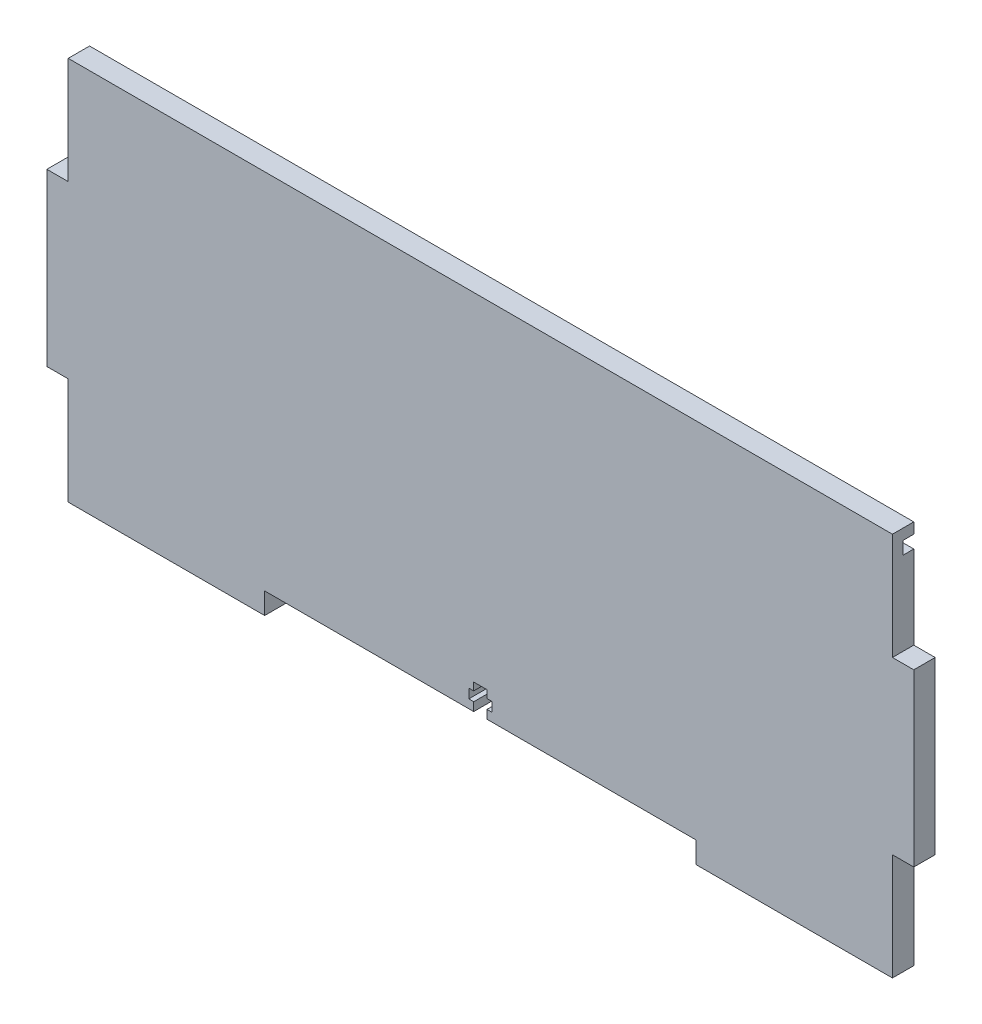
ISO-10303-21;
HEADER;
FILE_DESCRIPTION(('STEP AP214'),'2;1');
FILE_NAME('part.step','',(''),(''),'','','');
FILE_SCHEMA(('AUTOMOTIVE_DESIGN { 1 0 10303 214 1 1 1 1 }'));
ENDSEC;
DATA;
#1=APPLICATION_CONTEXT('core data for automotive mechanical design processes');
#2=APPLICATION_PROTOCOL_DEFINITION('international standard','automotive_design',2000,#1);
#3=PRODUCT_CONTEXT('',#1,'mechanical');
#4=PRODUCT('Part','Part','',(#3));
#5=PRODUCT_RELATED_PRODUCT_CATEGORY('part','',(#4));
#6=PRODUCT_DEFINITION_FORMATION('','',#4);
#7=PRODUCT_DEFINITION_CONTEXT('part definition',#1,'design');
#8=PRODUCT_DEFINITION('design','',#6,#7);
#9=PRODUCT_DEFINITION_SHAPE('','',#8);
#10=(LENGTH_UNIT() NAMED_UNIT(*) SI_UNIT(.MILLI.,.METRE.));
#11=(NAMED_UNIT(*) PLANE_ANGLE_UNIT() SI_UNIT($,.RADIAN.));
#12=(NAMED_UNIT(*) SI_UNIT($,.STERADIAN.) SOLID_ANGLE_UNIT());
#13=UNCERTAINTY_MEASURE_WITH_UNIT(LENGTH_MEASURE(1.E-05),#10,'distance_accuracy_value','');
#14=(GEOMETRIC_REPRESENTATION_CONTEXT(3) GLOBAL_UNCERTAINTY_ASSIGNED_CONTEXT((#13)) GLOBAL_UNIT_ASSIGNED_CONTEXT((#10,
#11,#12)) REPRESENTATION_CONTEXT('',''));
#15=CARTESIAN_POINT('',(0.,0.,0.));
#16=DIRECTION('',(0.,0.,1.));
#17=DIRECTION('',(1.,0.,0.));
#18=AXIS2_PLACEMENT_3D('',#15,#16,#17);
#19=CARTESIAN_POINT('',(0.,0.,5.));
#20=DIRECTION('',(0.,0.,-1.));
#21=DIRECTION('',(-1.,0.,0.));
#22=AXIS2_PLACEMENT_3D('',#19,#20,#21);
#23=PLANE('',#22);
#24=DIRECTION('',(0.,-1.,0.));
#25=VECTOR('',#24,1.);
#26=CARTESIAN_POINT('',(99.95,0.,5.));
#27=LINE('',#26,#25);
#28=CARTESIAN_POINT('',(99.95,7.,5.));
#29=VERTEX_POINT('',#28);
#30=CARTESIAN_POINT('',(99.95,5.,5.));
#31=VERTEX_POINT('',#30);
#32=EDGE_CURVE('E281',#29,#31,#27,.T.);
#33=ORIENTED_EDGE('',*,*,#32,.F.);
#34=DIRECTION('',(1.,0.,0.));
#35=VECTOR('',#34,1.);
#36=CARTESIAN_POINT('',(0.,7.00000000000003,5.));
#37=LINE('',#36,#35);
#38=CARTESIAN_POINT('',(98.8,7.,5.));
#39=VERTEX_POINT('',#38);
#40=EDGE_CURVE('E283',#39,#29,#37,.T.);
#41=ORIENTED_EDGE('',*,*,#40,.F.);
#42=DIRECTION('',(0.,1.,0.));
#43=VECTOR('',#42,1.);
#44=CARTESIAN_POINT('',(98.8,0.,5.));
#45=LINE('',#44,#43);
#46=CARTESIAN_POINT('',(98.8,9.20000000000007,5.));
#47=VERTEX_POINT('',#46);
#48=EDGE_CURVE('E285',#39,#47,#45,.T.);
#49=ORIENTED_EDGE('',*,*,#48,.T.);
#50=DIRECTION('',(1.,0.,0.));
#51=VECTOR('',#50,1.);
#52=CARTESIAN_POINT('',(0.,9.20000000000007,5.));
#53=LINE('',#52,#51);
#54=CARTESIAN_POINT('',(99.95,9.20000000000007,5.));
#55=VERTEX_POINT('',#54);
#56=EDGE_CURVE('E288',#47,#55,#53,.T.);
#57=ORIENTED_EDGE('',*,*,#56,.T.);
#58=DIRECTION('',(0.,-1.,0.));
#59=VECTOR('',#58,1.);
#60=CARTESIAN_POINT('',(99.95,0.,5.));
#61=LINE('',#60,#59);
#62=CARTESIAN_POINT('',(99.95,11.,5.));
#63=VERTEX_POINT('',#62);
#64=EDGE_CURVE('E291',#63,#55,#61,.T.);
#65=ORIENTED_EDGE('',*,*,#64,.F.);
#66=DIRECTION('',(1.,0.,0.));
#67=VECTOR('',#66,1.);
#68=CARTESIAN_POINT('',(0.,11.,5.));
#69=LINE('',#68,#67);
#70=CARTESIAN_POINT('',(103.05,11.,5.));
#71=VERTEX_POINT('',#70);
#72=EDGE_CURVE('E256',#63,#71,#69,.T.);
#73=ORIENTED_EDGE('',*,*,#72,.T.);
#74=DIRECTION('',(0.,-1.,0.));
#75=VECTOR('',#74,1.);
#76=CARTESIAN_POINT('',(103.05,0.,5.));
#77=LINE('',#76,#75);
#78=CARTESIAN_POINT('',(103.05,9.20000000000007,5.));
#79=VERTEX_POINT('',#78);
#80=EDGE_CURVE('E248',#71,#79,#77,.T.);
#81=ORIENTED_EDGE('',*,*,#80,.T.);
#82=DIRECTION('',(1.,0.,0.));
#83=VECTOR('',#82,1.);
#84=CARTESIAN_POINT('',(0.,9.20000000000007,5.));
#85=LINE('',#84,#83);
#86=CARTESIAN_POINT('',(104.2,9.20000000000007,5.));
#87=VERTEX_POINT('',#86);
#88=EDGE_CURVE('E260',#79,#87,#85,.T.);
#89=ORIENTED_EDGE('',*,*,#88,.T.);
#90=DIRECTION('',(0.,1.,0.));
#91=VECTOR('',#90,1.);
#92=CARTESIAN_POINT('',(104.2,0.,5.));
#93=LINE('',#92,#91);
#94=CARTESIAN_POINT('',(104.2,7.,5.));
#95=VERTEX_POINT('',#94);
#96=EDGE_CURVE('E264',#95,#87,#93,.T.);
#97=ORIENTED_EDGE('',*,*,#96,.F.);
#98=DIRECTION('',(1.,0.,0.));
#99=VECTOR('',#98,1.);
#100=CARTESIAN_POINT('',(0.,7.00000000000003,5.));
#101=LINE('',#100,#99);
#102=CARTESIAN_POINT('',(103.05,7.,5.));
#103=VERTEX_POINT('',#102);
#104=EDGE_CURVE('E276',#103,#95,#101,.T.);
#105=ORIENTED_EDGE('',*,*,#104,.F.);
#106=DIRECTION('',(0.,-1.,0.));
#107=VECTOR('',#106,1.);
#108=CARTESIAN_POINT('',(103.05,0.,5.));
#109=LINE('',#108,#107);
#110=CARTESIAN_POINT('',(103.05,5.,5.));
#111=VERTEX_POINT('',#110);
#112=EDGE_CURVE('E278',#103,#111,#109,.T.);
#113=ORIENTED_EDGE('',*,*,#112,.T.);
#114=DIRECTION('',(1.,0.,0.));
#115=VECTOR('',#114,1.);
#116=CARTESIAN_POINT('',(152.,4.99999999999999,5.));
#117=LINE('',#116,#115);
#118=CARTESIAN_POINT('',(152.,4.99999999999999,5.));
#119=VERTEX_POINT('',#118);
#120=EDGE_CURVE('E390',#111,#119,#117,.T.);
#121=ORIENTED_EDGE('',*,*,#120,.T.);
#122=DIRECTION('',(0.,-1.,0.));
#123=VECTOR('',#122,1.);
#124=CARTESIAN_POINT('',(152.,0.,5.));
#125=LINE('',#124,#123);
#126=CARTESIAN_POINT('',(152.,0.,5.));
#127=VERTEX_POINT('',#126);
#128=EDGE_CURVE('E383',#119,#127,#125,.T.);
#129=ORIENTED_EDGE('',*,*,#128,.T.);
#130=DIRECTION('',(1.,0.,0.));
#131=VECTOR('',#130,1.);
#132=CARTESIAN_POINT('',(0.,0.,5.));
#133=LINE('',#132,#131);
#134=CARTESIAN_POINT('',(198.,0.,5.));
#135=VERTEX_POINT('',#134);
#136=EDGE_CURVE('E471',#127,#135,#133,.T.);
#137=ORIENTED_EDGE('',*,*,#136,.T.);
#138=DIRECTION('',(0.,1.,0.));
#139=VECTOR('',#138,1.);
#140=CARTESIAN_POINT('',(198.,0.,5.));
#141=LINE('',#140,#139);
#142=CARTESIAN_POINT('',(198.,25.,5.));
#143=VERTEX_POINT('',#142);
#144=EDGE_CURVE('E449',#135,#143,#141,.T.);
#145=ORIENTED_EDGE('',*,*,#144,.T.);
#146=DIRECTION('',(1.,0.,0.));
#147=VECTOR('',#146,1.);
#148=CARTESIAN_POINT('',(203.,25.,5.));
#149=LINE('',#148,#147);
#150=CARTESIAN_POINT('',(203.,25.,5.));
#151=VERTEX_POINT('',#150);
#152=EDGE_CURVE('E452',#143,#151,#149,.T.);
#153=ORIENTED_EDGE('',*,*,#152,.T.);
#154=DIRECTION('',(0.,1.,0.));
#155=VECTOR('',#154,1.);
#156=CARTESIAN_POINT('',(203.,0.,5.));
#157=LINE('',#156,#155);
#158=CARTESIAN_POINT('',(203.,65.,5.));
#159=VERTEX_POINT('',#158);
#160=EDGE_CURVE('E42',#151,#159,#157,.T.);
#161=ORIENTED_EDGE('',*,*,#160,.T.);
#162=DIRECTION('',(-1.,0.,0.));
#163=VECTOR('',#162,1.);
#164=CARTESIAN_POINT('',(203.,65.,5.));
#165=LINE('',#164,#163);
#166=CARTESIAN_POINT('',(198.,65.,5.));
#167=VERTEX_POINT('',#166);
#168=EDGE_CURVE('E411',#159,#167,#165,.T.);
#169=ORIENTED_EDGE('',*,*,#168,.T.);
#170=DIRECTION('',(0.,1.,0.));
#171=VECTOR('',#170,1.);
#172=CARTESIAN_POINT('',(198.,65.,5.));
#173=LINE('',#172,#171);
#174=CARTESIAN_POINT('',(198.,90.,5.));
#175=VERTEX_POINT('',#174);
#176=EDGE_CURVE('E414',#167,#175,#173,.T.);
#177=ORIENTED_EDGE('',*,*,#176,.T.);
#178=DIRECTION('',(-1.,0.,0.));
#179=VECTOR('',#178,1.);
#180=CARTESIAN_POINT('',(0.,90.,5.));
#181=LINE('',#180,#179);
#182=CARTESIAN_POINT('',(5.,90.,5.));
#183=VERTEX_POINT('',#182);
#184=EDGE_CURVE('E11',#175,#183,#181,.T.);
#185=ORIENTED_EDGE('',*,*,#184,.T.);
#186=DIRECTION('',(0.,-1.,0.));
#187=VECTOR('',#186,1.);
#188=CARTESIAN_POINT('',(5.,65.,5.));
#189=LINE('',#188,#187);
#190=CARTESIAN_POINT('',(5.,65.,5.));
#191=VERTEX_POINT('',#190);
#192=EDGE_CURVE('E362',#183,#191,#189,.T.);
#193=ORIENTED_EDGE('',*,*,#192,.T.);
#194=DIRECTION('',(-1.,0.,0.));
#195=VECTOR('',#194,1.);
#196=CARTESIAN_POINT('',(0.,65.,5.));
#197=LINE('',#196,#195);
#198=CARTESIAN_POINT('',(0.,65.,5.));
#199=VERTEX_POINT('',#198);
#200=EDGE_CURVE('E365',#191,#199,#197,.T.);
#201=ORIENTED_EDGE('',*,*,#200,.T.);
#202=DIRECTION('',(0.,-1.,0.));
#203=VECTOR('',#202,1.);
#204=CARTESIAN_POINT('',(0.,0.,5.));
#205=LINE('',#204,#203);
#206=CARTESIAN_POINT('',(0.,25.,5.));
#207=VERTEX_POINT('',#206);
#208=EDGE_CURVE('E468',#199,#207,#205,.T.);
#209=ORIENTED_EDGE('',*,*,#208,.T.);
#210=DIRECTION('',(1.,0.,0.));
#211=VECTOR('',#210,1.);
#212=CARTESIAN_POINT('',(0.,25.,5.));
#213=LINE('',#212,#211);
#214=CARTESIAN_POINT('',(5.,25.,5.));
#215=VERTEX_POINT('',#214);
#216=EDGE_CURVE('E433',#207,#215,#213,.T.);
#217=ORIENTED_EDGE('',*,*,#216,.T.);
#218=DIRECTION('',(0.,-1.,0.));
#219=VECTOR('',#218,1.);
#220=CARTESIAN_POINT('',(5.,0.,5.));
#221=LINE('',#220,#219);
#222=CARTESIAN_POINT('',(5.,0.,5.));
#223=VERTEX_POINT('',#222);
#224=EDGE_CURVE('E436',#215,#223,#221,.T.);
#225=ORIENTED_EDGE('',*,*,#224,.T.);
#226=CARTESIAN_POINT('',(51.,0.,5.));
#227=VERTEX_POINT('',#226);
#228=EDGE_CURVE('E473',#223,#227,#133,.T.);
#229=ORIENTED_EDGE('',*,*,#228,.T.);
#230=DIRECTION('',(0.,1.,0.));
#231=VECTOR('',#230,1.);
#232=CARTESIAN_POINT('',(51.,0.,5.));
#233=LINE('',#232,#231);
#234=CARTESIAN_POINT('',(51.,5.00000000000001,5.));
#235=VERTEX_POINT('',#234);
#236=EDGE_CURVE('E386',#227,#235,#233,.T.);
#237=ORIENTED_EDGE('',*,*,#236,.T.);
#238=EDGE_CURVE('E391',#235,#31,#117,.T.);
#239=ORIENTED_EDGE('',*,*,#238,.T.);
#240=EDGE_LOOP('',(#33,#41,#49,#57,#65,#73,#81,#89,#97,#105,#113,#121,#129,#137,#145,#153,#161,
#169,#177,#185,#193,#201,#209,#217,#225,#229,#237,#239));
#241=FACE_BOUND('',#240,.T.);
#242=ADVANCED_FACE('F33',(#241),#23,.F.);
#243=CARTESIAN_POINT('',(0.,0.,0.));
#244=DIRECTION('',(0.,0.,-1.));
#245=DIRECTION('',(-1.,0.,0.));
#246=AXIS2_PLACEMENT_3D('',#243,#244,#245);
#247=PLANE('',#246);
#248=DIRECTION('',(1.,0.,0.));
#249=VECTOR('',#248,1.);
#250=CARTESIAN_POINT('',(0.,7.00000000000003,0.));
#251=LINE('',#250,#249);
#252=CARTESIAN_POINT('',(98.8,7.,0.));
#253=VERTEX_POINT('',#252);
#254=CARTESIAN_POINT('',(99.95,7.,0.));
#255=VERTEX_POINT('',#254);
#256=EDGE_CURVE('E307',#253,#255,#251,.T.);
#257=ORIENTED_EDGE('',*,*,#256,.T.);
#258=DIRECTION('',(0.,-1.,0.));
#259=VECTOR('',#258,1.);
#260=CARTESIAN_POINT('',(99.95,0.,0.));
#261=LINE('',#260,#259);
#262=CARTESIAN_POINT('',(99.95,5.,0.));
#263=VERTEX_POINT('',#262);
#264=EDGE_CURVE('E304',#255,#263,#261,.T.);
#265=ORIENTED_EDGE('',*,*,#264,.T.);
#266=DIRECTION('',(1.,0.,0.));
#267=VECTOR('',#266,1.);
#268=CARTESIAN_POINT('',(152.,4.99999999999999,0.));
#269=LINE('',#268,#267);
#270=CARTESIAN_POINT('',(51.,5.00000000000001,0.));
#271=VERTEX_POINT('',#270);
#272=EDGE_CURVE('E387',#271,#263,#269,.T.);
#273=ORIENTED_EDGE('',*,*,#272,.F.);
#274=DIRECTION('',(0.,1.,0.));
#275=VECTOR('',#274,1.);
#276=CARTESIAN_POINT('',(51.,0.,0.));
#277=LINE('',#276,#275);
#278=CARTESIAN_POINT('',(51.,0.,0.));
#279=VERTEX_POINT('',#278);
#280=EDGE_CURVE('E396',#279,#271,#277,.T.);
#281=ORIENTED_EDGE('',*,*,#280,.F.);
#282=DIRECTION('',(1.,0.,0.));
#283=VECTOR('',#282,1.);
#284=CARTESIAN_POINT('',(0.,0.,0.));
#285=LINE('',#284,#283);
#286=CARTESIAN_POINT('',(5.,0.,0.));
#287=VERTEX_POINT('',#286);
#288=EDGE_CURVE('E479',#287,#279,#285,.T.);
#289=ORIENTED_EDGE('',*,*,#288,.F.);
#290=DIRECTION('',(0.,-1.,0.));
#291=VECTOR('',#290,1.);
#292=CARTESIAN_POINT('',(5.,0.,0.));
#293=LINE('',#292,#291);
#294=CARTESIAN_POINT('',(5.,25.,0.));
#295=VERTEX_POINT('',#294);
#296=EDGE_CURVE('E437',#295,#287,#293,.T.);
#297=ORIENTED_EDGE('',*,*,#296,.F.);
#298=DIRECTION('',(1.,0.,0.));
#299=VECTOR('',#298,1.);
#300=CARTESIAN_POINT('',(0.,25.,0.));
#301=LINE('',#300,#299);
#302=CARTESIAN_POINT('',(0.,25.,0.));
#303=VERTEX_POINT('',#302);
#304=EDGE_CURVE('E378',#303,#295,#301,.T.);
#305=ORIENTED_EDGE('',*,*,#304,.F.);
#306=DIRECTION('',(0.,-1.,0.));
#307=VECTOR('',#306,1.);
#308=CARTESIAN_POINT('',(0.,0.,0.));
#309=LINE('',#308,#307);
#310=CARTESIAN_POINT('',(0.,65.,0.));
#311=VERTEX_POINT('',#310);
#312=EDGE_CURVE('E463',#311,#303,#309,.T.);
#313=ORIENTED_EDGE('',*,*,#312,.F.);
#314=DIRECTION('',(-1.,0.,0.));
#315=VECTOR('',#314,1.);
#316=CARTESIAN_POINT('',(0.,65.,0.));
#317=LINE('',#316,#315);
#318=CARTESIAN_POINT('',(5.,65.,0.));
#319=VERTEX_POINT('',#318);
#320=EDGE_CURVE('E366',#319,#311,#317,.T.);
#321=ORIENTED_EDGE('',*,*,#320,.F.);
#322=DIRECTION('',(0.,-1.,0.));
#323=VECTOR('',#322,1.);
#324=CARTESIAN_POINT('',(5.,65.,0.));
#325=LINE('',#324,#323);
#326=CARTESIAN_POINT('',(5.,84.5,0.));
#327=VERTEX_POINT('',#326);
#328=EDGE_CURVE('E373',#327,#319,#325,.T.);
#329=ORIENTED_EDGE('',*,*,#328,.F.);
#330=DIRECTION('',(-1.,0.,0.));
#331=VECTOR('',#330,1.);
#332=CARTESIAN_POINT('',(198.,84.5,0.));
#333=LINE('',#332,#331);
#334=CARTESIAN_POINT('',(198.,84.5,0.));
#335=VERTEX_POINT('',#334);
#336=EDGE_CURVE('E320',#335,#327,#333,.T.);
#337=ORIENTED_EDGE('',*,*,#336,.F.);
#338=DIRECTION('',(0.,1.,0.));
#339=VECTOR('',#338,1.);
#340=CARTESIAN_POINT('',(198.,65.,0.));
#341=LINE('',#340,#339);
#342=CARTESIAN_POINT('',(198.,65.,0.));
#343=VERTEX_POINT('',#342);
#344=EDGE_CURVE('E415',#343,#335,#341,.T.);
#345=ORIENTED_EDGE('',*,*,#344,.F.);
#346=DIRECTION('',(-1.,0.,0.));
#347=VECTOR('',#346,1.);
#348=CARTESIAN_POINT('',(203.,65.,0.));
#349=LINE('',#348,#347);
#350=CARTESIAN_POINT('',(203.,65.,0.));
#351=VERTEX_POINT('',#350);
#352=EDGE_CURVE('E419',#351,#343,#349,.T.);
#353=ORIENTED_EDGE('',*,*,#352,.F.);
#354=DIRECTION('',(0.,1.,0.));
#355=VECTOR('',#354,1.);
#356=CARTESIAN_POINT('',(203.,0.,0.));
#357=LINE('',#356,#355);
#358=CARTESIAN_POINT('',(203.,25.,0.));
#359=VERTEX_POINT('',#358);
#360=EDGE_CURVE('E480',#359,#351,#357,.T.);
#361=ORIENTED_EDGE('',*,*,#360,.F.);
#362=DIRECTION('',(1.,0.,0.));
#363=VECTOR('',#362,1.);
#364=CARTESIAN_POINT('',(203.,25.,0.));
#365=LINE('',#364,#363);
#366=CARTESIAN_POINT('',(198.,25.,0.));
#367=VERTEX_POINT('',#366);
#368=EDGE_CURVE('E453',#367,#359,#365,.T.);
#369=ORIENTED_EDGE('',*,*,#368,.F.);
#370=DIRECTION('',(0.,1.,0.));
#371=VECTOR('',#370,1.);
#372=CARTESIAN_POINT('',(198.,0.,0.));
#373=LINE('',#372,#371);
#374=CARTESIAN_POINT('',(198.,0.,0.));
#375=VERTEX_POINT('',#374);
#376=EDGE_CURVE('E429',#375,#367,#373,.T.);
#377=ORIENTED_EDGE('',*,*,#376,.F.);
#378=CARTESIAN_POINT('',(152.,0.,0.));
#379=VERTEX_POINT('',#378);
#380=EDGE_CURVE('E478',#379,#375,#285,.T.);
#381=ORIENTED_EDGE('',*,*,#380,.F.);
#382=DIRECTION('',(0.,-1.,0.));
#383=VECTOR('',#382,1.);
#384=CARTESIAN_POINT('',(152.,0.,0.));
#385=LINE('',#384,#383);
#386=CARTESIAN_POINT('',(152.,4.99999999999999,0.));
#387=VERTEX_POINT('',#386);
#388=EDGE_CURVE('E355',#387,#379,#385,.T.);
#389=ORIENTED_EDGE('',*,*,#388,.F.);
#390=CARTESIAN_POINT('',(103.05,5.,0.));
#391=VERTEX_POINT('',#390);
#392=EDGE_CURVE('E399',#391,#387,#269,.T.);
#393=ORIENTED_EDGE('',*,*,#392,.F.);
#394=DIRECTION('',(0.,-1.,0.));
#395=VECTOR('',#394,1.);
#396=CARTESIAN_POINT('',(103.05,0.,0.));
#397=LINE('',#396,#395);
#398=CARTESIAN_POINT('',(103.05,7.,0.));
#399=VERTEX_POINT('',#398);
#400=EDGE_CURVE('E50',#399,#391,#397,.T.);
#401=ORIENTED_EDGE('',*,*,#400,.F.);
#402=DIRECTION('',(1.,0.,0.));
#403=VECTOR('',#402,1.);
#404=CARTESIAN_POINT('',(0.,7.00000000000003,0.));
#405=LINE('',#404,#403);
#406=CARTESIAN_POINT('',(104.2,7.,0.));
#407=VERTEX_POINT('',#406);
#408=EDGE_CURVE('E300',#399,#407,#405,.T.);
#409=ORIENTED_EDGE('',*,*,#408,.T.);
#410=DIRECTION('',(0.,1.,0.));
#411=VECTOR('',#410,1.);
#412=CARTESIAN_POINT('',(104.2,0.,0.));
#413=LINE('',#412,#411);
#414=CARTESIAN_POINT('',(104.2,9.20000000000007,0.));
#415=VERTEX_POINT('',#414);
#416=EDGE_CURVE('E297',#407,#415,#413,.T.);
#417=ORIENTED_EDGE('',*,*,#416,.T.);
#418=DIRECTION('',(1.,0.,0.));
#419=VECTOR('',#418,1.);
#420=CARTESIAN_POINT('',(0.,9.20000000000007,0.));
#421=LINE('',#420,#419);
#422=CARTESIAN_POINT('',(103.05,9.20000000000007,0.));
#423=VERTEX_POINT('',#422);
#424=EDGE_CURVE('E295',#423,#415,#421,.T.);
#425=ORIENTED_EDGE('',*,*,#424,.F.);
#426=DIRECTION('',(0.,-1.,0.));
#427=VECTOR('',#426,1.);
#428=CARTESIAN_POINT('',(103.05,0.,0.));
#429=LINE('',#428,#427);
#430=CARTESIAN_POINT('',(103.05,11.,0.));
#431=VERTEX_POINT('',#430);
#432=EDGE_CURVE('E251',#431,#423,#429,.T.);
#433=ORIENTED_EDGE('',*,*,#432,.F.);
#434=DIRECTION('',(1.,0.,0.));
#435=VECTOR('',#434,1.);
#436=CARTESIAN_POINT('',(0.,11.,0.));
#437=LINE('',#436,#435);
#438=CARTESIAN_POINT('',(99.95,11.,0.));
#439=VERTEX_POINT('',#438);
#440=EDGE_CURVE('E269',#439,#431,#437,.T.);
#441=ORIENTED_EDGE('',*,*,#440,.F.);
#442=DIRECTION('',(0.,-1.,0.));
#443=VECTOR('',#442,1.);
#444=CARTESIAN_POINT('',(99.95,0.,0.));
#445=LINE('',#444,#443);
#446=CARTESIAN_POINT('',(99.95,9.20000000000007,0.));
#447=VERTEX_POINT('',#446);
#448=EDGE_CURVE('E272',#439,#447,#445,.T.);
#449=ORIENTED_EDGE('',*,*,#448,.T.);
#450=DIRECTION('',(1.,0.,0.));
#451=VECTOR('',#450,1.);
#452=CARTESIAN_POINT('',(0.,9.20000000000007,0.));
#453=LINE('',#452,#451);
#454=CARTESIAN_POINT('',(98.8,9.20000000000007,0.));
#455=VERTEX_POINT('',#454);
#456=EDGE_CURVE('E313',#455,#447,#453,.T.);
#457=ORIENTED_EDGE('',*,*,#456,.F.);
#458=DIRECTION('',(0.,1.,0.));
#459=VECTOR('',#458,1.);
#460=CARTESIAN_POINT('',(98.8,0.,0.));
#461=LINE('',#460,#459);
#462=EDGE_CURVE('E310',#253,#455,#461,.T.);
#463=ORIENTED_EDGE('',*,*,#462,.F.);
#464=EDGE_LOOP('',(#257,#265,#273,#281,#289,#297,#305,#313,#321,#329,#337,#345,#353,#361,#369,
#377,#381,#389,#393,#401,#409,#417,#425,#433,#441,#449,#457,#463));
#465=FACE_BOUND('',#464,.T.);
#466=ADVANCED_FACE('F496',(#465),#247,.T.);
#467=CARTESIAN_POINT('',(152.,4.99999999999999,5.));
#468=DIRECTION('',(0.,1.,0.));
#469=DIRECTION('',(-1.,0.,0.));
#470=AXIS2_PLACEMENT_3D('',#467,#468,#469);
#471=PLANE('',#470);
#472=DIRECTION('',(0.,0.,-1.));
#473=VECTOR('',#472,1.);
#474=CARTESIAN_POINT('',(99.95,5.,5.));
#475=LINE('',#474,#473);
#476=EDGE_CURVE('E331',#31,#263,#475,.T.);
#477=ORIENTED_EDGE('',*,*,#476,.F.);
#478=ORIENTED_EDGE('',*,*,#238,.F.);
#479=DIRECTION('',(0.,0.,-1.));
#480=VECTOR('',#479,1.);
#481=CARTESIAN_POINT('',(51.,5.00000000000001,5.));
#482=LINE('',#481,#480);
#483=EDGE_CURVE('E405',#235,#271,#482,.T.);
#484=ORIENTED_EDGE('',*,*,#483,.T.);
#485=ORIENTED_EDGE('',*,*,#272,.T.);
#486=EDGE_LOOP('',(#477,#478,#484,#485));
#487=FACE_BOUND('',#486,.T.);
#488=ADVANCED_FACE('F604',(#487),#471,.F.);
#489=DIRECTION('',(1.,0.,0.));
#490=VECTOR('',#489,1.);
#491=CARTESIAN_POINT('',(198.,87.5,0.));
#492=LINE('',#491,#490);
#493=CARTESIAN_POINT('',(5.,87.5,0.));
#494=VERTEX_POINT('',#493);
#495=CARTESIAN_POINT('',(198.,87.5,0.));
#496=VERTEX_POINT('',#495);
#497=EDGE_CURVE('E342',#494,#496,#492,.T.);
#498=ORIENTED_EDGE('',*,*,#497,.F.);
#499=CARTESIAN_POINT('',(5.,90.,0.));
#500=VERTEX_POINT('',#499);
#501=EDGE_CURVE('E370',#500,#494,#325,.T.);
#502=ORIENTED_EDGE('',*,*,#501,.F.);
#503=DIRECTION('',(-1.,0.,0.));
#504=VECTOR('',#503,1.);
#505=CARTESIAN_POINT('',(0.,90.,0.));
#506=LINE('',#505,#504);
#507=CARTESIAN_POINT('',(198.,90.,0.));
#508=VERTEX_POINT('',#507);
#509=EDGE_CURVE('E37',#508,#500,#506,.T.);
#510=ORIENTED_EDGE('',*,*,#509,.F.);
#511=EDGE_CURVE('E422',#496,#508,#341,.T.);
#512=ORIENTED_EDGE('',*,*,#511,.F.);
#513=EDGE_LOOP('',(#498,#502,#510,#512));
#514=FACE_BOUND('',#513,.T.);
#515=ADVANCED_FACE('F526',(#514),#247,.T.);
#516=CARTESIAN_POINT('',(0.,0.,5.));
#517=DIRECTION('',(0.,1.,0.));
#518=DIRECTION('',(0.,0.,1.));
#519=AXIS2_PLACEMENT_3D('',#516,#517,#518);
#520=PLANE('',#519);
#521=ORIENTED_EDGE('',*,*,#136,.F.);
#522=DIRECTION('',(0.,0.,-1.));
#523=VECTOR('',#522,1.);
#524=CARTESIAN_POINT('',(152.,0.,5.));
#525=LINE('',#524,#523);
#526=EDGE_CURVE('E394',#127,#379,#525,.T.);
#527=ORIENTED_EDGE('',*,*,#526,.T.);
#528=ORIENTED_EDGE('',*,*,#380,.T.);
#529=DIRECTION('',(0.,0.,-1.));
#530=VECTOR('',#529,1.);
#531=CARTESIAN_POINT('',(198.,0.,5.));
#532=LINE('',#531,#530);
#533=EDGE_CURVE('E456',#135,#375,#532,.T.);
#534=ORIENTED_EDGE('',*,*,#533,.F.);
#535=EDGE_LOOP('',(#521,#527,#528,#534));
#536=FACE_BOUND('',#535,.T.);
#537=ADVANCED_FACE('F561',(#536),#520,.F.);
#538=CARTESIAN_POINT('',(0.,0.,5.));
#539=DIRECTION('',(1.,0.,0.));
#540=DIRECTION('',(0.,0.,-1.));
#541=AXIS2_PLACEMENT_3D('',#538,#539,#540);
#542=PLANE('',#541);
#543=ORIENTED_EDGE('',*,*,#208,.F.);
#544=DIRECTION('',(0.,0.,-1.));
#545=VECTOR('',#544,1.);
#546=CARTESIAN_POINT('',(0.,65.,5.));
#547=LINE('',#546,#545);
#548=EDGE_CURVE('E375',#199,#311,#547,.T.);
#549=ORIENTED_EDGE('',*,*,#548,.T.);
#550=ORIENTED_EDGE('',*,*,#312,.T.);
#551=DIRECTION('',(0.,0.,-1.));
#552=VECTOR('',#551,1.);
#553=CARTESIAN_POINT('',(0.,25.,5.));
#554=LINE('',#553,#552);
#555=EDGE_CURVE('E440',#207,#303,#554,.T.);
#556=ORIENTED_EDGE('',*,*,#555,.F.);
#557=EDGE_LOOP('',(#543,#549,#550,#556));
#558=FACE_BOUND('',#557,.T.);
#559=ADVANCED_FACE('F35',(#558),#542,.F.);
#560=ORIENTED_EDGE('',*,*,#288,.T.);
#561=DIRECTION('',(0.,0.,-1.));
#562=VECTOR('',#561,1.);
#563=CARTESIAN_POINT('',(51.,0.,5.));
#564=LINE('',#563,#562);
#565=EDGE_CURVE('E407',#227,#279,#564,.T.);
#566=ORIENTED_EDGE('',*,*,#565,.F.);
#567=ORIENTED_EDGE('',*,*,#228,.F.);
#568=DIRECTION('',(0.,0.,-1.));
#569=VECTOR('',#568,1.);
#570=CARTESIAN_POINT('',(5.,0.,5.));
#571=LINE('',#570,#569);
#572=EDGE_CURVE('E423',#223,#287,#571,.T.);
#573=ORIENTED_EDGE('',*,*,#572,.T.);
#574=EDGE_LOOP('',(#560,#566,#567,#573));
#575=FACE_BOUND('',#574,.T.);
#576=ADVANCED_FACE('F490',(#575),#520,.F.);
#577=CARTESIAN_POINT('',(203.,0.,5.));
#578=DIRECTION('',(-1.,0.,0.));
#579=DIRECTION('',(0.,0.,1.));
#580=AXIS2_PLACEMENT_3D('',#577,#578,#579);
#581=PLANE('',#580);
#582=ORIENTED_EDGE('',*,*,#360,.T.);
#583=DIRECTION('',(0.,0.,-1.));
#584=VECTOR('',#583,1.);
#585=CARTESIAN_POINT('',(203.,65.,5.));
#586=LINE('',#585,#584);
#587=EDGE_CURVE('E418',#159,#351,#586,.T.);
#588=ORIENTED_EDGE('',*,*,#587,.F.);
#589=ORIENTED_EDGE('',*,*,#160,.F.);
#590=DIRECTION('',(0.,0.,-1.));
#591=VECTOR('',#590,1.);
#592=CARTESIAN_POINT('',(203.,25.,5.));
#593=LINE('',#592,#591);
#594=EDGE_CURVE('E460',#151,#359,#593,.T.);
#595=ORIENTED_EDGE('',*,*,#594,.T.);
#596=EDGE_LOOP('',(#582,#588,#589,#595));
#597=FACE_BOUND('',#596,.T.);
#598=ADVANCED_FACE('F548',(#597),#581,.F.);
#599=CARTESIAN_POINT('',(0.,90.,5.));
#600=DIRECTION('',(0.,-1.,0.));
#601=DIRECTION('',(0.,0.,-1.));
#602=AXIS2_PLACEMENT_3D('',#599,#600,#601);
#603=PLANE('',#602);
#604=ORIENTED_EDGE('',*,*,#509,.T.);
#605=DIRECTION('',(0.,0.,-1.));
#606=VECTOR('',#605,1.);
#607=CARTESIAN_POINT('',(5.,90.,5.));
#608=LINE('',#607,#606);
#609=EDGE_CURVE('E369',#183,#500,#608,.T.);
#610=ORIENTED_EDGE('',*,*,#609,.F.);
#611=ORIENTED_EDGE('',*,*,#184,.F.);
#612=DIRECTION('',(0.,0.,-1.));
#613=VECTOR('',#612,1.);
#614=CARTESIAN_POINT('',(198.,90.,5.));
#615=LINE('',#614,#613);
#616=EDGE_CURVE('E426',#175,#508,#615,.T.);
#617=ORIENTED_EDGE('',*,*,#616,.T.);
#618=EDGE_LOOP('',(#604,#610,#611,#617));
#619=FACE_BOUND('',#618,.T.);
#620=ADVANCED_FACE('F521',(#619),#603,.F.);
#621=CARTESIAN_POINT('',(203.,25.,5.));
#622=DIRECTION('',(0.,1.,0.));
#623=DIRECTION('',(0.,0.,1.));
#624=AXIS2_PLACEMENT_3D('',#621,#622,#623);
#625=PLANE('',#624);
#626=ORIENTED_EDGE('',*,*,#368,.T.);
#627=ORIENTED_EDGE('',*,*,#594,.F.);
#628=ORIENTED_EDGE('',*,*,#152,.F.);
#629=DIRECTION('',(0.,0.,-1.));
#630=VECTOR('',#629,1.);
#631=CARTESIAN_POINT('',(198.,25.,5.));
#632=LINE('',#631,#630);
#633=EDGE_CURVE('E464',#143,#367,#632,.T.);
#634=ORIENTED_EDGE('',*,*,#633,.T.);
#635=EDGE_LOOP('',(#626,#627,#628,#634));
#636=FACE_BOUND('',#635,.T.);
#637=ADVANCED_FACE('F552',(#636),#625,.F.);
#638=CARTESIAN_POINT('',(198.,0.,5.));
#639=DIRECTION('',(-1.,0.,0.));
#640=DIRECTION('',(0.,0.,1.));
#641=AXIS2_PLACEMENT_3D('',#638,#639,#640);
#642=PLANE('',#641);
#643=ORIENTED_EDGE('',*,*,#376,.T.);
#644=ORIENTED_EDGE('',*,*,#633,.F.);
#645=ORIENTED_EDGE('',*,*,#144,.F.);
#646=ORIENTED_EDGE('',*,*,#533,.T.);
#647=EDGE_LOOP('',(#643,#644,#645,#646));
#648=FACE_BOUND('',#647,.T.);
#649=ADVANCED_FACE('F557',(#648),#642,.F.);
#650=CARTESIAN_POINT('',(198.,65.,5.));
#651=DIRECTION('',(-1.,0.,0.));
#652=DIRECTION('',(0.,0.,1.));
#653=AXIS2_PLACEMENT_3D('',#650,#651,#652);
#654=PLANE('',#653);
#655=DIRECTION('',(0.,-1.,0.));
#656=VECTOR('',#655,1.);
#657=CARTESIAN_POINT('',(198.,87.5,2.5));
#658=LINE('',#657,#656);
#659=CARTESIAN_POINT('',(198.,87.5,2.5));
#660=VERTEX_POINT('',#659);
#661=CARTESIAN_POINT('',(198.,84.5,2.5));
#662=VERTEX_POINT('',#661);
#663=EDGE_CURVE('E340',#660,#662,#658,.T.);
#664=ORIENTED_EDGE('',*,*,#663,.F.);
#665=DIRECTION('',(0.,0.,-1.));
#666=VECTOR('',#665,1.);
#667=CARTESIAN_POINT('',(198.,87.5,2.5));
#668=LINE('',#667,#666);
#669=EDGE_CURVE('E352',#660,#496,#668,.T.);
#670=ORIENTED_EDGE('',*,*,#669,.T.);
#671=ORIENTED_EDGE('',*,*,#511,.T.);
#672=ORIENTED_EDGE('',*,*,#616,.F.);
#673=ORIENTED_EDGE('',*,*,#176,.F.);
#674=DIRECTION('',(0.,0.,-1.));
#675=VECTOR('',#674,1.);
#676=CARTESIAN_POINT('',(198.,65.,5.));
#677=LINE('',#676,#675);
#678=EDGE_CURVE('E430',#167,#343,#677,.T.);
#679=ORIENTED_EDGE('',*,*,#678,.T.);
#680=ORIENTED_EDGE('',*,*,#344,.T.);
#681=DIRECTION('',(0.,0.,-1.));
#682=VECTOR('',#681,1.);
#683=CARTESIAN_POINT('',(198.,84.5,2.5));
#684=LINE('',#683,#682);
#685=EDGE_CURVE('E349',#662,#335,#684,.T.);
#686=ORIENTED_EDGE('',*,*,#685,.F.);
#687=EDGE_LOOP('',(#664,#670,#671,#672,#673,#679,#680,#686));
#688=FACE_BOUND('',#687,.T.);
#689=ADVANCED_FACE('F536',(#688),#654,.F.);
#690=CARTESIAN_POINT('',(203.,65.,5.));
#691=DIRECTION('',(0.,-1.,0.));
#692=DIRECTION('',(0.,0.,-1.));
#693=AXIS2_PLACEMENT_3D('',#690,#691,#692);
#694=PLANE('',#693);
#695=ORIENTED_EDGE('',*,*,#352,.T.);
#696=ORIENTED_EDGE('',*,*,#678,.F.);
#697=ORIENTED_EDGE('',*,*,#168,.F.);
#698=ORIENTED_EDGE('',*,*,#587,.T.);
#699=EDGE_LOOP('',(#695,#696,#697,#698));
#700=FACE_BOUND('',#699,.T.);
#701=ADVANCED_FACE('F545',(#700),#694,.F.);
#702=CARTESIAN_POINT('',(5.,0.,5.));
#703=DIRECTION('',(1.,0.,0.));
#704=DIRECTION('',(0.,0.,-1.));
#705=AXIS2_PLACEMENT_3D('',#702,#703,#704);
#706=PLANE('',#705);
#707=ORIENTED_EDGE('',*,*,#296,.T.);
#708=ORIENTED_EDGE('',*,*,#572,.F.);
#709=ORIENTED_EDGE('',*,*,#224,.F.);
#710=DIRECTION('',(0.,0.,-1.));
#711=VECTOR('',#710,1.);
#712=CARTESIAN_POINT('',(5.,25.,5.));
#713=LINE('',#712,#711);
#714=EDGE_CURVE('E446',#215,#295,#713,.T.);
#715=ORIENTED_EDGE('',*,*,#714,.T.);
#716=EDGE_LOOP('',(#707,#708,#709,#715));
#717=FACE_BOUND('',#716,.T.);
#718=ADVANCED_FACE('F504',(#717),#706,.F.);
#719=CARTESIAN_POINT('',(0.,25.,5.));
#720=DIRECTION('',(0.,1.,0.));
#721=DIRECTION('',(-1.,0.,0.));
#722=AXIS2_PLACEMENT_3D('',#719,#720,#721);
#723=PLANE('',#722);
#724=ORIENTED_EDGE('',*,*,#304,.T.);
#725=ORIENTED_EDGE('',*,*,#714,.F.);
#726=ORIENTED_EDGE('',*,*,#216,.F.);
#727=ORIENTED_EDGE('',*,*,#555,.T.);
#728=EDGE_LOOP('',(#724,#725,#726,#727));
#729=FACE_BOUND('',#728,.T.);
#730=ADVANCED_FACE('F506',(#729),#723,.F.);
#731=CARTESIAN_POINT('',(0.,65.,5.));
#732=DIRECTION('',(0.,-1.,0.));
#733=DIRECTION('',(0.,0.,-1.));
#734=AXIS2_PLACEMENT_3D('',#731,#732,#733);
#735=PLANE('',#734);
#736=ORIENTED_EDGE('',*,*,#320,.T.);
#737=ORIENTED_EDGE('',*,*,#548,.F.);
#738=ORIENTED_EDGE('',*,*,#200,.F.);
#739=DIRECTION('',(0.,0.,-1.));
#740=VECTOR('',#739,1.);
#741=CARTESIAN_POINT('',(5.,65.,5.));
#742=LINE('',#741,#740);
#743=EDGE_CURVE('E379',#191,#319,#742,.T.);
#744=ORIENTED_EDGE('',*,*,#743,.T.);
#745=EDGE_LOOP('',(#736,#737,#738,#744));
#746=FACE_BOUND('',#745,.T.);
#747=ADVANCED_FACE('F514',(#746),#735,.F.);
#748=CARTESIAN_POINT('',(5.,65.,5.));
#749=DIRECTION('',(1.,0.,0.));
#750=DIRECTION('',(0.,1.,0.));
#751=AXIS2_PLACEMENT_3D('',#748,#749,#750);
#752=PLANE('',#751);
#753=ORIENTED_EDGE('',*,*,#501,.T.);
#754=DIRECTION('',(0.,0.,-1.));
#755=VECTOR('',#754,1.);
#756=CARTESIAN_POINT('',(5.,87.5,2.5));
#757=LINE('',#756,#755);
#758=CARTESIAN_POINT('',(5.,87.5,2.5));
#759=VERTEX_POINT('',#758);
#760=EDGE_CURVE('E356',#759,#494,#757,.T.);
#761=ORIENTED_EDGE('',*,*,#760,.F.);
#762=DIRECTION('',(0.,1.,0.));
#763=VECTOR('',#762,1.);
#764=CARTESIAN_POINT('',(5.,87.5,2.5));
#765=LINE('',#764,#763);
#766=CARTESIAN_POINT('',(5.,84.5,2.5));
#767=VERTEX_POINT('',#766);
#768=EDGE_CURVE('E344',#767,#759,#765,.T.);
#769=ORIENTED_EDGE('',*,*,#768,.F.);
#770=DIRECTION('',(0.,0.,-1.));
#771=VECTOR('',#770,1.);
#772=CARTESIAN_POINT('',(5.,84.5,2.5));
#773=LINE('',#772,#771);
#774=EDGE_CURVE('E358',#767,#327,#773,.T.);
#775=ORIENTED_EDGE('',*,*,#774,.T.);
#776=ORIENTED_EDGE('',*,*,#328,.T.);
#777=ORIENTED_EDGE('',*,*,#743,.F.);
#778=ORIENTED_EDGE('',*,*,#192,.F.);
#779=ORIENTED_EDGE('',*,*,#609,.T.);
#780=EDGE_LOOP('',(#753,#761,#769,#775,#776,#777,#778,#779));
#781=FACE_BOUND('',#780,.T.);
#782=ADVANCED_FACE('F518',(#781),#752,.F.);
#783=CARTESIAN_POINT('',(152.,0.,5.));
#784=DIRECTION('',(1.,0.,0.));
#785=DIRECTION('',(0.,0.,-1.));
#786=AXIS2_PLACEMENT_3D('',#783,#784,#785);
#787=PLANE('',#786);
#788=ORIENTED_EDGE('',*,*,#388,.T.);
#789=ORIENTED_EDGE('',*,*,#526,.F.);
#790=ORIENTED_EDGE('',*,*,#128,.F.);
#791=DIRECTION('',(0.,0.,-1.));
#792=VECTOR('',#791,1.);
#793=CARTESIAN_POINT('',(152.,4.99999999999999,5.));
#794=LINE('',#793,#792);
#795=EDGE_CURVE('E402',#119,#387,#794,.T.);
#796=ORIENTED_EDGE('',*,*,#795,.T.);
#797=EDGE_LOOP('',(#788,#789,#790,#796));
#798=FACE_BOUND('',#797,.T.);
#799=ADVANCED_FACE('F564',(#798),#787,.F.);
#800=ORIENTED_EDGE('',*,*,#120,.F.);
#801=DIRECTION('',(0.,0.,-1.));
#802=VECTOR('',#801,1.);
#803=CARTESIAN_POINT('',(103.05,5.,5.));
#804=LINE('',#803,#802);
#805=EDGE_CURVE('E333',#111,#391,#804,.T.);
#806=ORIENTED_EDGE('',*,*,#805,.T.);
#807=ORIENTED_EDGE('',*,*,#392,.T.);
#808=ORIENTED_EDGE('',*,*,#795,.F.);
#809=EDGE_LOOP('',(#800,#806,#807,#808));
#810=FACE_BOUND('',#809,.T.);
#811=ADVANCED_FACE('F570',(#810),#471,.F.);
#812=CARTESIAN_POINT('',(51.,0.,5.));
#813=DIRECTION('',(-1.,0.,0.));
#814=DIRECTION('',(0.,-1.,0.));
#815=AXIS2_PLACEMENT_3D('',#812,#813,#814);
#816=PLANE('',#815);
#817=ORIENTED_EDGE('',*,*,#280,.T.);
#818=ORIENTED_EDGE('',*,*,#483,.F.);
#819=ORIENTED_EDGE('',*,*,#236,.F.);
#820=ORIENTED_EDGE('',*,*,#565,.T.);
#821=EDGE_LOOP('',(#817,#818,#819,#820));
#822=FACE_BOUND('',#821,.T.);
#823=ADVANCED_FACE('F500',(#822),#816,.F.);
#824=CARTESIAN_POINT('',(198.,87.5,2.5));
#825=DIRECTION('',(0.,1.,0.));
#826=DIRECTION('',(0.,0.,1.));
#827=AXIS2_PLACEMENT_3D('',#824,#825,#826);
#828=PLANE('',#827);
#829=ORIENTED_EDGE('',*,*,#497,.T.);
#830=ORIENTED_EDGE('',*,*,#669,.F.);
#831=DIRECTION('',(1.,0.,0.));
#832=VECTOR('',#831,1.);
#833=CARTESIAN_POINT('',(198.,87.5,2.5));
#834=LINE('',#833,#832);
#835=EDGE_CURVE('E346',#759,#660,#834,.T.);
#836=ORIENTED_EDGE('',*,*,#835,.F.);
#837=ORIENTED_EDGE('',*,*,#760,.T.);
#838=EDGE_LOOP('',(#829,#830,#836,#837));
#839=FACE_BOUND('',#838,.T.);
#840=ADVANCED_FACE('F531',(#839),#828,.F.);
#841=CARTESIAN_POINT('',(198.,84.5,2.5));
#842=DIRECTION('',(0.,-1.,0.));
#843=DIRECTION('',(0.,0.,-1.));
#844=AXIS2_PLACEMENT_3D('',#841,#842,#843);
#845=PLANE('',#844);
#846=ORIENTED_EDGE('',*,*,#336,.T.);
#847=ORIENTED_EDGE('',*,*,#774,.F.);
#848=DIRECTION('',(-1.,0.,0.));
#849=VECTOR('',#848,1.);
#850=CARTESIAN_POINT('',(198.,84.5,2.5));
#851=LINE('',#850,#849);
#852=EDGE_CURVE('E58',#662,#767,#851,.T.);
#853=ORIENTED_EDGE('',*,*,#852,.F.);
#854=ORIENTED_EDGE('',*,*,#685,.T.);
#855=EDGE_LOOP('',(#846,#847,#853,#854));
#856=FACE_BOUND('',#855,.T.);
#857=ADVANCED_FACE('F540',(#856),#845,.F.);
#858=CARTESIAN_POINT('',(0.,0.,2.5));
#859=DIRECTION('',(0.,0.,-1.));
#860=DIRECTION('',(-1.,0.,0.));
#861=AXIS2_PLACEMENT_3D('',#858,#859,#860);
#862=PLANE('',#861);
#863=ORIENTED_EDGE('',*,*,#663,.T.);
#864=ORIENTED_EDGE('',*,*,#852,.T.);
#865=ORIENTED_EDGE('',*,*,#768,.T.);
#866=ORIENTED_EDGE('',*,*,#835,.T.);
#867=EDGE_LOOP('',(#863,#864,#865,#866));
#868=FACE_BOUND('',#867,.T.);
#869=ADVANCED_FACE('F533',(#868),#862,.T.);
#870=CARTESIAN_POINT('',(103.05,0.,5.));
#871=DIRECTION('',(1.,0.,0.));
#872=DIRECTION('',(0.,0.,-1.));
#873=AXIS2_PLACEMENT_3D('',#870,#871,#872);
#874=PLANE('',#873);
#875=ORIENTED_EDGE('',*,*,#432,.T.);
#876=DIRECTION('',(0.,0.,-1.));
#877=VECTOR('',#876,1.);
#878=CARTESIAN_POINT('',(103.05,9.20000000000007,5.));
#879=LINE('',#878,#877);
#880=EDGE_CURVE('E244',#79,#423,#879,.T.);
#881=ORIENTED_EDGE('',*,*,#880,.F.);
#882=ORIENTED_EDGE('',*,*,#80,.F.);
#883=DIRECTION('',(0.,0.,-1.));
#884=VECTOR('',#883,1.);
#885=CARTESIAN_POINT('',(103.05,11.,5.));
#886=LINE('',#885,#884);
#887=EDGE_CURVE('E318',#71,#431,#886,.T.);
#888=ORIENTED_EDGE('',*,*,#887,.T.);
#889=EDGE_LOOP('',(#875,#881,#882,#888));
#890=FACE_BOUND('',#889,.T.);
#891=ADVANCED_FACE('F246',(#890),#874,.F.);
#892=CARTESIAN_POINT('',(0.,11.,5.));
#893=DIRECTION('',(0.,1.,0.));
#894=DIRECTION('',(0.,0.,1.));
#895=AXIS2_PLACEMENT_3D('',#892,#893,#894);
#896=PLANE('',#895);
#897=ORIENTED_EDGE('',*,*,#440,.T.);
#898=ORIENTED_EDGE('',*,*,#887,.F.);
#899=ORIENTED_EDGE('',*,*,#72,.F.);
#900=DIRECTION('',(0.,0.,-1.));
#901=VECTOR('',#900,1.);
#902=CARTESIAN_POINT('',(99.95,11.,5.));
#903=LINE('',#902,#901);
#904=EDGE_CURVE('E321',#63,#439,#903,.T.);
#905=ORIENTED_EDGE('',*,*,#904,.T.);
#906=EDGE_LOOP('',(#897,#898,#899,#905));
#907=FACE_BOUND('',#906,.T.);
#908=ADVANCED_FACE('F583',(#907),#896,.F.);
#909=CARTESIAN_POINT('',(99.95,0.,5.));
#910=DIRECTION('',(1.,0.,0.));
#911=DIRECTION('',(0.,0.,-1.));
#912=AXIS2_PLACEMENT_3D('',#909,#910,#911);
#913=PLANE('',#912);
#914=ORIENTED_EDGE('',*,*,#448,.F.);
#915=ORIENTED_EDGE('',*,*,#904,.F.);
#916=ORIENTED_EDGE('',*,*,#64,.T.);
#917=DIRECTION('',(0.,0.,-1.));
#918=VECTOR('',#917,1.);
#919=CARTESIAN_POINT('',(99.95,9.20000000000007,5.));
#920=LINE('',#919,#918);
#921=EDGE_CURVE('E323',#55,#447,#920,.T.);
#922=ORIENTED_EDGE('',*,*,#921,.T.);
#923=EDGE_LOOP('',(#914,#915,#916,#922));
#924=FACE_BOUND('',#923,.T.);
#925=ADVANCED_FACE('F585',(#924),#913,.T.);
#926=CARTESIAN_POINT('',(0.,9.20000000000007,5.));
#927=DIRECTION('',(0.,1.,0.));
#928=DIRECTION('',(0.,0.,1.));
#929=AXIS2_PLACEMENT_3D('',#926,#927,#928);
#930=PLANE('',#929);
#931=ORIENTED_EDGE('',*,*,#456,.T.);
#932=ORIENTED_EDGE('',*,*,#921,.F.);
#933=ORIENTED_EDGE('',*,*,#56,.F.);
#934=DIRECTION('',(0.,0.,-1.));
#935=VECTOR('',#934,1.);
#936=CARTESIAN_POINT('',(98.8,9.20000000000007,5.));
#937=LINE('',#936,#935);
#938=EDGE_CURVE('E325',#47,#455,#937,.T.);
#939=ORIENTED_EDGE('',*,*,#938,.T.);
#940=EDGE_LOOP('',(#931,#932,#933,#939));
#941=FACE_BOUND('',#940,.T.);
#942=ADVANCED_FACE('F589',(#941),#930,.F.);
#943=CARTESIAN_POINT('',(98.8,0.,5.));
#944=DIRECTION('',(-1.,0.,0.));
#945=DIRECTION('',(0.,0.,1.));
#946=AXIS2_PLACEMENT_3D('',#943,#944,#945);
#947=PLANE('',#946);
#948=ORIENTED_EDGE('',*,*,#462,.T.);
#949=ORIENTED_EDGE('',*,*,#938,.F.);
#950=ORIENTED_EDGE('',*,*,#48,.F.);
#951=DIRECTION('',(0.,0.,-1.));
#952=VECTOR('',#951,1.);
#953=CARTESIAN_POINT('',(98.8,7.,5.));
#954=LINE('',#953,#952);
#955=EDGE_CURVE('E327',#39,#253,#954,.T.);
#956=ORIENTED_EDGE('',*,*,#955,.T.);
#957=EDGE_LOOP('',(#948,#949,#950,#956));
#958=FACE_BOUND('',#957,.T.);
#959=ADVANCED_FACE('F593',(#958),#947,.F.);
#960=CARTESIAN_POINT('',(0.,7.00000000000003,5.));
#961=DIRECTION('',(0.,1.,0.));
#962=DIRECTION('',(-1.,0.,0.));
#963=AXIS2_PLACEMENT_3D('',#960,#961,#962);
#964=PLANE('',#963);
#965=ORIENTED_EDGE('',*,*,#256,.F.);
#966=ORIENTED_EDGE('',*,*,#955,.F.);
#967=ORIENTED_EDGE('',*,*,#40,.T.);
#968=DIRECTION('',(0.,0.,-1.));
#969=VECTOR('',#968,1.);
#970=CARTESIAN_POINT('',(99.95,7.,5.));
#971=LINE('',#970,#969);
#972=EDGE_CURVE('E329',#29,#255,#971,.T.);
#973=ORIENTED_EDGE('',*,*,#972,.T.);
#974=EDGE_LOOP('',(#965,#966,#967,#973));
#975=FACE_BOUND('',#974,.T.);
#976=ADVANCED_FACE('F597',(#975),#964,.T.);
#977=CARTESIAN_POINT('',(99.95,0.,5.));
#978=DIRECTION('',(1.,0.,0.));
#979=DIRECTION('',(0.,0.,-1.));
#980=AXIS2_PLACEMENT_3D('',#977,#978,#979);
#981=PLANE('',#980);
#982=ORIENTED_EDGE('',*,*,#264,.F.);
#983=ORIENTED_EDGE('',*,*,#972,.F.);
#984=ORIENTED_EDGE('',*,*,#32,.T.);
#985=ORIENTED_EDGE('',*,*,#476,.T.);
#986=EDGE_LOOP('',(#982,#983,#984,#985));
#987=FACE_BOUND('',#986,.T.);
#988=ADVANCED_FACE('F601',(#987),#981,.T.);
#989=CARTESIAN_POINT('',(103.05,0.,5.));
#990=DIRECTION('',(1.,0.,0.));
#991=DIRECTION('',(0.,0.,-1.));
#992=AXIS2_PLACEMENT_3D('',#989,#990,#991);
#993=PLANE('',#992);
#994=ORIENTED_EDGE('',*,*,#400,.T.);
#995=ORIENTED_EDGE('',*,*,#805,.F.);
#996=ORIENTED_EDGE('',*,*,#112,.F.);
#997=DIRECTION('',(0.,0.,-1.));
#998=VECTOR('',#997,1.);
#999=CARTESIAN_POINT('',(103.05,7.,5.));
#1000=LINE('',#999,#998);
#1001=EDGE_CURVE('E335',#103,#399,#1000,.T.);
#1002=ORIENTED_EDGE('',*,*,#1001,.T.);
#1003=EDGE_LOOP('',(#994,#995,#996,#1002));
#1004=FACE_BOUND('',#1003,.T.);
#1005=ADVANCED_FACE('F835',(#1004),#993,.F.);
#1006=CARTESIAN_POINT('',(0.,7.00000000000003,5.));
#1007=DIRECTION('',(0.,1.,0.));
#1008=DIRECTION('',(-1.,0.,0.));
#1009=AXIS2_PLACEMENT_3D('',#1006,#1007,#1008);
#1010=PLANE('',#1009);
#1011=ORIENTED_EDGE('',*,*,#408,.F.);
#1012=ORIENTED_EDGE('',*,*,#1001,.F.);
#1013=ORIENTED_EDGE('',*,*,#104,.T.);
#1014=DIRECTION('',(0.,0.,-1.));
#1015=VECTOR('',#1014,1.);
#1016=CARTESIAN_POINT('',(104.2,7.,5.));
#1017=LINE('',#1016,#1015);
#1018=EDGE_CURVE('E337',#95,#407,#1017,.T.);
#1019=ORIENTED_EDGE('',*,*,#1018,.T.);
#1020=EDGE_LOOP('',(#1011,#1012,#1013,#1019));
#1021=FACE_BOUND('',#1020,.T.);
#1022=ADVANCED_FACE('F575',(#1021),#1010,.T.);
#1023=CARTESIAN_POINT('',(104.2,0.,5.));
#1024=DIRECTION('',(-1.,0.,0.));
#1025=DIRECTION('',(0.,0.,1.));
#1026=AXIS2_PLACEMENT_3D('',#1023,#1024,#1025);
#1027=PLANE('',#1026);
#1028=ORIENTED_EDGE('',*,*,#416,.F.);
#1029=ORIENTED_EDGE('',*,*,#1018,.F.);
#1030=ORIENTED_EDGE('',*,*,#96,.T.);
#1031=DIRECTION('',(0.,0.,-1.));
#1032=VECTOR('',#1031,1.);
#1033=CARTESIAN_POINT('',(104.2,9.20000000000007,5.));
#1034=LINE('',#1033,#1032);
#1035=EDGE_CURVE('E255',#87,#415,#1034,.T.);
#1036=ORIENTED_EDGE('',*,*,#1035,.T.);
#1037=EDGE_LOOP('',(#1028,#1029,#1030,#1036));
#1038=FACE_BOUND('',#1037,.T.);
#1039=ADVANCED_FACE('F578',(#1038),#1027,.T.);
#1040=CARTESIAN_POINT('',(0.,9.20000000000007,5.));
#1041=DIRECTION('',(0.,1.,0.));
#1042=DIRECTION('',(0.,0.,1.));
#1043=AXIS2_PLACEMENT_3D('',#1040,#1041,#1042);
#1044=PLANE('',#1043);
#1045=ORIENTED_EDGE('',*,*,#424,.T.);
#1046=ORIENTED_EDGE('',*,*,#1035,.F.);
#1047=ORIENTED_EDGE('',*,*,#88,.F.);
#1048=ORIENTED_EDGE('',*,*,#880,.T.);
#1049=EDGE_LOOP('',(#1045,#1046,#1047,#1048));
#1050=FACE_BOUND('',#1049,.T.);
#1051=ADVANCED_FACE('F261',(#1050),#1044,.F.);
#1052=CLOSED_SHELL('',(#242,#466,#488,#515,#537,#559,#576,#598,#620,#637,#649,#689,#701,#718,
#730,#747,#782,#799,#811,#823,#840,#857,#869,#891,#908,#925,#942,#959,#976,#988,#1005,#1022,
#1039,#1051));
#1053=MANIFOLD_SOLID_BREP('B2',#1052);
#1054=ADVANCED_BREP_SHAPE_REPRESENTATION('',(#18,#1053),#14);
#1055=SHAPE_DEFINITION_REPRESENTATION(#9,#1054);
ENDSEC;
END-ISO-10303-21;
